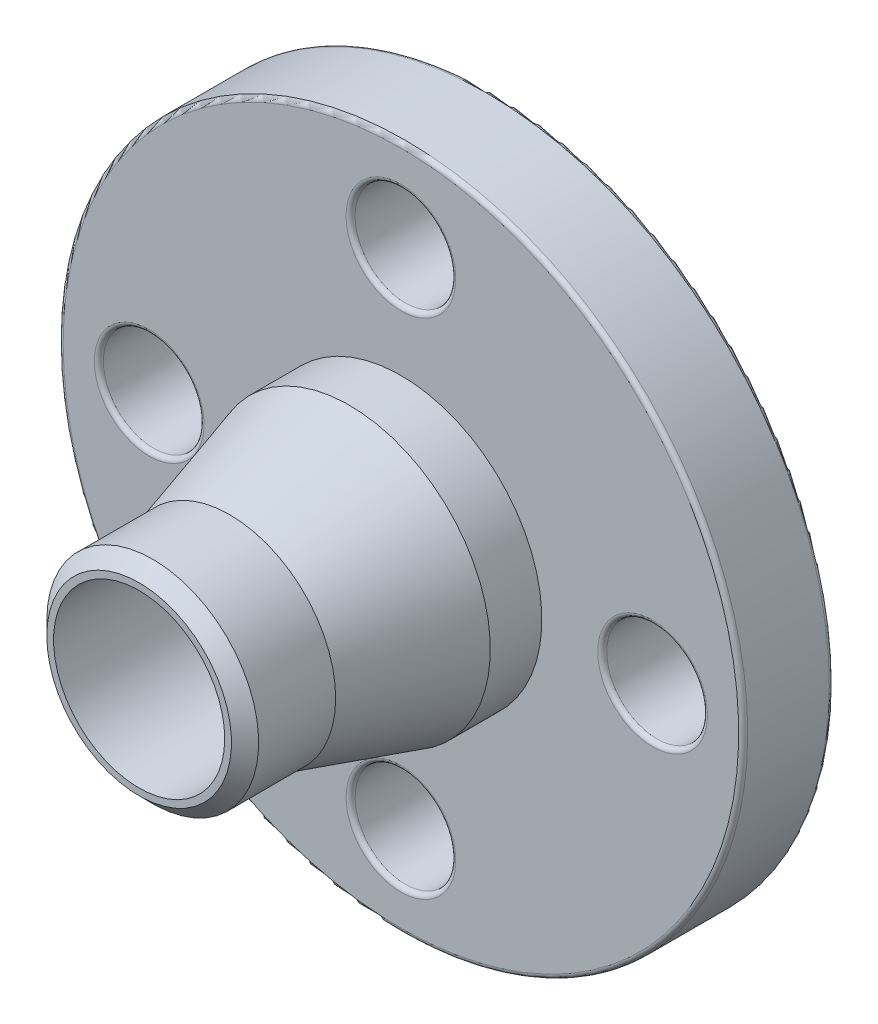
ISO-10303-21;
HEADER;
FILE_DESCRIPTION(('STEP AP214'),'2;1');
FILE_NAME('part.step','',(''),(''),'','','');
FILE_SCHEMA(('AUTOMOTIVE_DESIGN { 1 0 10303 214 1 1 1 1 }'));
ENDSEC;
DATA;
#1=APPLICATION_CONTEXT('core data for automotive mechanical design processes');
#2=APPLICATION_PROTOCOL_DEFINITION('international standard','automotive_design',2000,#1);
#3=PRODUCT_CONTEXT('',#1,'mechanical');
#4=PRODUCT('Part','Part','',(#3));
#5=PRODUCT_RELATED_PRODUCT_CATEGORY('part','',(#4));
#6=PRODUCT_DEFINITION_FORMATION('','',#4);
#7=PRODUCT_DEFINITION_CONTEXT('part definition',#1,'design');
#8=PRODUCT_DEFINITION('design','',#6,#7);
#9=PRODUCT_DEFINITION_SHAPE('','',#8);
#10=(LENGTH_UNIT() NAMED_UNIT(*) SI_UNIT(.MILLI.,.METRE.));
#11=(NAMED_UNIT(*) PLANE_ANGLE_UNIT() SI_UNIT($,.RADIAN.));
#12=(NAMED_UNIT(*) SI_UNIT($,.STERADIAN.) SOLID_ANGLE_UNIT());
#13=UNCERTAINTY_MEASURE_WITH_UNIT(LENGTH_MEASURE(1.E-05),#10,'distance_accuracy_value','');
#14=(GEOMETRIC_REPRESENTATION_CONTEXT(3) GLOBAL_UNCERTAINTY_ASSIGNED_CONTEXT((#13)) GLOBAL_UNIT_ASSIGNED_CONTEXT((#10,
#11,#12)) REPRESENTATION_CONTEXT('',''));
#15=CARTESIAN_POINT('',(0.,0.,0.));
#16=DIRECTION('',(0.,0.,1.));
#17=DIRECTION('',(1.,0.,0.));
#18=AXIS2_PLACEMENT_3D('',#15,#16,#17);
#19=CARTESIAN_POINT('',(0.,0.,-13.49375));
#20=DIRECTION('',(0.,0.,-1.));
#21=DIRECTION('',(-1.,0.,0.));
#22=AXIS2_PLACEMENT_3D('',#19,#20,#21);
#23=CONICAL_SURFACE('',#22,24.60625,0.2849682946417);
#24=CARTESIAN_POINT('',(0.,0.,13.49375));
#25=DIRECTION('',(0.,0.,1.));
#26=DIRECTION('',(1.,0.,0.));
#27=AXIS2_PLACEMENT_3D('',#24,#25,#26);
#28=CIRCLE('',#27,16.7005);
#29=CARTESIAN_POINT('',(16.7005,0.,13.49375));
#30=VERTEX_POINT('',#29);
#31=EDGE_CURVE('E65',#30,#30,#28,.T.);
#32=ORIENTED_EDGE('',*,*,#31,.F.);
#33=EDGE_LOOP('',(#32));
#34=FACE_BOUND('',#33,.T.);
#35=CARTESIAN_POINT('',(0.,0.,-5.36498493975903));
#36=DIRECTION('',(0.,0.,-1.));
#37=DIRECTION('',(-1.,0.,0.));
#38=AXIS2_PLACEMENT_3D('',#35,#36,#37);
#39=CIRCLE('',#38,22.225);
#40=CARTESIAN_POINT('',(-22.225,0.,-5.36498493975903));
#41=VERTEX_POINT('',#40);
#42=EDGE_CURVE('E62',#41,#41,#39,.T.);
#43=ORIENTED_EDGE('',*,*,#42,.F.);
#44=EDGE_LOOP('',(#43));
#45=FACE_BOUND('',#44,.T.);
#46=ADVANCED_FACE('F44',(#34,#45),#23,.T.);
#47=CARTESIAN_POINT('',(0.,0.,27.78125));
#48=DIRECTION('',(0.,0.,1.));
#49=DIRECTION('',(1.,0.,0.));
#50=AXIS2_PLACEMENT_3D('',#47,#48,#49);
#51=CYLINDRICAL_SURFACE('',#50,16.7005);
#52=CARTESIAN_POINT('',(0.,0.,25.638125));
#53=DIRECTION('',(0.,0.,-1.));
#54=DIRECTION('',(-1.,0.,0.));
#55=AXIS2_PLACEMENT_3D('',#52,#53,#54);
#56=CIRCLE('',#55,16.7005);
#57=CARTESIAN_POINT('',(-16.7005,0.,25.638125));
#58=VERTEX_POINT('',#57);
#59=EDGE_CURVE('E91',#58,#58,#56,.T.);
#60=ORIENTED_EDGE('',*,*,#59,.T.);
#61=EDGE_LOOP('',(#60));
#62=FACE_BOUND('',#61,.T.);
#63=ORIENTED_EDGE('',*,*,#31,.T.);
#64=EDGE_LOOP('',(#63));
#65=FACE_BOUND('',#64,.T.);
#66=ADVANCED_FACE('F193',(#62,#65),#51,.T.);
#67=CARTESIAN_POINT('',(0.,16.7005,27.78125));
#68=DIRECTION('',(0.,0.,-1.));
#69=DIRECTION('',(-1.,0.,0.));
#70=AXIS2_PLACEMENT_3D('',#67,#68,#69);
#71=PLANE('',#70);
#72=CARTESIAN_POINT('',(0.,0.,27.78125));
#73=DIRECTION('',(0.,0.,-1.));
#74=DIRECTION('',(-1.,0.,0.));
#75=AXIS2_PLACEMENT_3D('',#72,#73,#74);
#76=CIRCLE('',#75,14.557375);
#77=CARTESIAN_POINT('',(-14.557375,0.,27.78125));
#78=VERTEX_POINT('',#77);
#79=EDGE_CURVE('E87',#78,#78,#76,.F.);
#80=ORIENTED_EDGE('',*,*,#79,.T.);
#81=EDGE_LOOP('',(#80));
#82=FACE_BOUND('',#81,.T.);
#83=CARTESIAN_POINT('',(0.,0.,27.78125));
#84=DIRECTION('',(0.,0.,1.));
#85=DIRECTION('',(1.,0.,0.));
#86=AXIS2_PLACEMENT_3D('',#83,#84,#85);
#87=CIRCLE('',#86,13.49375);
#88=CARTESIAN_POINT('',(13.49375,0.,27.78125));
#89=VERTEX_POINT('',#88);
#90=EDGE_CURVE('E72',#89,#89,#87,.T.);
#91=ORIENTED_EDGE('',*,*,#90,.F.);
#92=EDGE_LOOP('',(#91));
#93=FACE_BOUND('',#92,.T.);
#94=ADVANCED_FACE('F201',(#82,#93),#71,.F.);
#95=CARTESIAN_POINT('',(0.,0.,27.78125));
#96=DIRECTION('',(0.,0.,1.));
#97=DIRECTION('',(1.,0.,0.));
#98=AXIS2_PLACEMENT_3D('',#95,#96,#97);
#99=CYLINDRICAL_SURFACE('',#98,13.49375);
#100=CARTESIAN_POINT('',(0.,0.,-21.43125));
#101=DIRECTION('',(0.,0.,1.));
#102=DIRECTION('',(1.,0.,0.));
#103=AXIS2_PLACEMENT_3D('',#100,#101,#102);
#104=CIRCLE('',#103,13.49375);
#105=CARTESIAN_POINT('',(13.49375,0.,-21.43125));
#106=VERTEX_POINT('',#105);
#107=EDGE_CURVE('E48',#106,#106,#104,.F.);
#108=ORIENTED_EDGE('',*,*,#107,.T.);
#109=EDGE_LOOP('',(#108));
#110=FACE_BOUND('',#109,.T.);
#111=ORIENTED_EDGE('',*,*,#90,.T.);
#112=EDGE_LOOP('',(#111));
#113=FACE_BOUND('',#112,.T.);
#114=ADVANCED_FACE('F215',(#110,#113),#99,.F.);
#115=CARTESIAN_POINT('',(0.,13.49375,-27.78125));
#116=DIRECTION('',(0.,0.,1.));
#117=DIRECTION('',(1.,0.,0.));
#118=AXIS2_PLACEMENT_3D('',#115,#116,#117);
#119=PLANE('',#118);
#120=CARTESIAN_POINT('',(0.,0.,-27.78125));
#121=DIRECTION('',(0.,0.,-1.));
#122=DIRECTION('',(-1.,0.,0.));
#123=AXIS2_PLACEMENT_3D('',#120,#121,#122);
#124=CIRCLE('',#123,22.225);
#125=CARTESIAN_POINT('',(-22.225,0.,-27.78125));
#126=VERTEX_POINT('',#125);
#127=EDGE_CURVE('E289',#126,#126,#124,.T.);
#128=ORIENTED_EDGE('',*,*,#127,.F.);
#129=EDGE_LOOP('',(#128));
#130=FACE_BOUND('',#129,.T.);
#131=CARTESIAN_POINT('',(0.,0.,-27.78125));
#132=DIRECTION('',(0.,0.,1.));
#133=DIRECTION('',(1.,0.,0.));
#134=AXIS2_PLACEMENT_3D('',#131,#132,#133);
#135=CIRCLE('',#134,53.260625);
#136=CARTESIAN_POINT('',(53.260625,0.,-27.78125));
#137=VERTEX_POINT('',#136);
#138=EDGE_CURVE('E111',#137,#137,#135,.F.);
#139=ORIENTED_EDGE('',*,*,#138,.T.);
#140=EDGE_LOOP('',(#139));
#141=FACE_BOUND('',#140,.T.);
#142=CARTESIAN_POINT('',(0.,39.6875,-27.78125));
#143=DIRECTION('',(0.,0.,1.));
#144=DIRECTION('',(1.,0.,0.));
#145=AXIS2_PLACEMENT_3D('',#142,#143,#144);
#146=CIRCLE('',#145,8.651875);
#147=CARTESIAN_POINT('',(8.651875,39.6875,-27.78125));
#148=VERTEX_POINT('',#147);
#149=EDGE_CURVE('E107',#148,#148,#146,.T.);
#150=ORIENTED_EDGE('',*,*,#149,.T.);
#151=EDGE_LOOP('',(#150));
#152=FACE_BOUND('',#151,.T.);
#153=CARTESIAN_POINT('',(-39.6875,4.15704496906011E-13,-27.78125));
#154=DIRECTION('',(0.,0.,1.));
#155=DIRECTION('',(1.,0.,0.));
#156=AXIS2_PLACEMENT_3D('',#153,#154,#155);
#157=CIRCLE('',#156,8.651875);
#158=CARTESIAN_POINT('',(-31.035625,4.15704496906011E-13,-27.78125));
#159=VERTEX_POINT('',#158);
#160=EDGE_CURVE('E103',#159,#159,#157,.T.);
#161=ORIENTED_EDGE('',*,*,#160,.T.);
#162=EDGE_LOOP('',(#161));
#163=FACE_BOUND('',#162,.T.);
#164=CARTESIAN_POINT('',(0.,-39.6875,-27.78125));
#165=DIRECTION('',(0.,0.,1.));
#166=DIRECTION('',(1.,0.,0.));
#167=AXIS2_PLACEMENT_3D('',#164,#165,#166);
#168=CIRCLE('',#167,8.651875);
#169=CARTESIAN_POINT('',(8.651875,-39.6875,-27.78125));
#170=VERTEX_POINT('',#169);
#171=EDGE_CURVE('E99',#170,#170,#168,.T.);
#172=ORIENTED_EDGE('',*,*,#171,.T.);
#173=EDGE_LOOP('',(#172));
#174=FACE_BOUND('',#173,.T.);
#175=CARTESIAN_POINT('',(39.6875,-1.38568165635337E-13,-27.78125));
#176=DIRECTION('',(0.,0.,1.));
#177=DIRECTION('',(1.,0.,0.));
#178=AXIS2_PLACEMENT_3D('',#175,#176,#177);
#179=CIRCLE('',#178,8.651875);
#180=CARTESIAN_POINT('',(48.339375,-1.38568165635337E-13,-27.78125));
#181=VERTEX_POINT('',#180);
#182=EDGE_CURVE('E95',#181,#181,#179,.T.);
#183=ORIENTED_EDGE('',*,*,#182,.T.);
#184=EDGE_LOOP('',(#183));
#185=FACE_BOUND('',#184,.T.);
#186=ADVANCED_FACE('F211',(#130,#141,#152,#163,#174,#185),#119,.F.);
#187=CARTESIAN_POINT('',(0.,0.,27.78125));
#188=DIRECTION('',(0.,0.,1.));
#189=DIRECTION('',(1.,0.,0.));
#190=AXIS2_PLACEMENT_3D('',#187,#188,#189);
#191=CYLINDRICAL_SURFACE('',#190,53.975);
#192=CARTESIAN_POINT('',(0.,0.,-27.066875));
#193=DIRECTION('',(0.,0.,1.));
#194=DIRECTION('',(1.,0.,0.));
#195=AXIS2_PLACEMENT_3D('',#192,#193,#194);
#196=CIRCLE('',#195,53.975);
#197=CARTESIAN_POINT('',(53.975,0.,-27.066875));
#198=VERTEX_POINT('',#197);
#199=EDGE_CURVE('E119',#198,#198,#196,.T.);
#200=ORIENTED_EDGE('',*,*,#199,.T.);
#201=EDGE_LOOP('',(#200));
#202=FACE_BOUND('',#201,.T.);
#203=CARTESIAN_POINT('',(0.,0.,-14.208125));
#204=DIRECTION('',(0.,0.,-1.));
#205=DIRECTION('',(-1.,0.,0.));
#206=AXIS2_PLACEMENT_3D('',#203,#204,#205);
#207=CIRCLE('',#206,53.975);
#208=CARTESIAN_POINT('',(-53.975,0.,-14.208125));
#209=VERTEX_POINT('',#208);
#210=EDGE_CURVE('E115',#209,#209,#207,.T.);
#211=ORIENTED_EDGE('',*,*,#210,.T.);
#212=EDGE_LOOP('',(#211));
#213=FACE_BOUND('',#212,.T.);
#214=ADVANCED_FACE('F208',(#202,#213),#191,.T.);
#215=CARTESIAN_POINT('',(0.,53.975,-13.49375));
#216=DIRECTION('',(0.,0.,-1.));
#217=DIRECTION('',(-1.,0.,0.));
#218=AXIS2_PLACEMENT_3D('',#215,#216,#217);
#219=PLANE('',#218);
#220=CARTESIAN_POINT('',(0.,0.,-13.49375));
#221=DIRECTION('',(0.,0.,-1.));
#222=DIRECTION('',(-1.,0.,0.));
#223=AXIS2_PLACEMENT_3D('',#220,#221,#222);
#224=CIRCLE('',#223,53.260625);
#225=CARTESIAN_POINT('',(-53.260625,0.,-13.49375));
#226=VERTEX_POINT('',#225);
#227=EDGE_CURVE('E11',#226,#226,#224,.F.);
#228=ORIENTED_EDGE('',*,*,#227,.T.);
#229=EDGE_LOOP('',(#228));
#230=FACE_BOUND('',#229,.T.);
#231=CARTESIAN_POINT('',(0.,39.6875,-13.49375));
#232=DIRECTION('',(0.,0.,-1.));
#233=DIRECTION('',(-1.,0.,0.));
#234=AXIS2_PLACEMENT_3D('',#231,#232,#233);
#235=CIRCLE('',#234,8.651875);
#236=CARTESIAN_POINT('',(-8.651875,39.6875,-13.49375));
#237=VERTEX_POINT('',#236);
#238=EDGE_CURVE('E53',#237,#237,#235,.T.);
#239=ORIENTED_EDGE('',*,*,#238,.T.);
#240=EDGE_LOOP('',(#239));
#241=FACE_BOUND('',#240,.T.);
#242=CARTESIAN_POINT('',(-39.6875,4.15704496906011E-13,-13.49375));
#243=DIRECTION('',(0.,0.,-1.));
#244=DIRECTION('',(-1.,0.,0.));
#245=AXIS2_PLACEMENT_3D('',#242,#243,#244);
#246=CIRCLE('',#245,8.651875);
#247=CARTESIAN_POINT('',(-48.339375,4.15704496906011E-13,-13.49375));
#248=VERTEX_POINT('',#247);
#249=EDGE_CURVE('E59',#248,#248,#246,.T.);
#250=ORIENTED_EDGE('',*,*,#249,.T.);
#251=EDGE_LOOP('',(#250));
#252=FACE_BOUND('',#251,.T.);
#253=CARTESIAN_POINT('',(0.,-39.6875,-13.49375));
#254=DIRECTION('',(0.,0.,-1.));
#255=DIRECTION('',(-1.,0.,0.));
#256=AXIS2_PLACEMENT_3D('',#253,#254,#255);
#257=CIRCLE('',#256,8.651875);
#258=CARTESIAN_POINT('',(-8.651875,-39.6875,-13.49375));
#259=VERTEX_POINT('',#258);
#260=EDGE_CURVE('E159',#259,#259,#257,.T.);
#261=ORIENTED_EDGE('',*,*,#260,.T.);
#262=EDGE_LOOP('',(#261));
#263=FACE_BOUND('',#262,.T.);
#264=CARTESIAN_POINT('',(39.6875,-1.38568165635337E-13,-13.49375));
#265=DIRECTION('',(0.,0.,-1.));
#266=DIRECTION('',(-1.,0.,0.));
#267=AXIS2_PLACEMENT_3D('',#264,#265,#266);
#268=CIRCLE('',#267,8.651875);
#269=CARTESIAN_POINT('',(31.035625,-1.38568165635337E-13,-13.49375));
#270=VERTEX_POINT('',#269);
#271=EDGE_CURVE('E155',#270,#270,#268,.T.);
#272=ORIENTED_EDGE('',*,*,#271,.T.);
#273=EDGE_LOOP('',(#272));
#274=FACE_BOUND('',#273,.T.);
#275=CARTESIAN_POINT('',(0.,0.,-13.49375));
#276=DIRECTION('',(0.,0.,-1.));
#277=DIRECTION('',(-1.,0.,0.));
#278=AXIS2_PLACEMENT_3D('',#275,#276,#277);
#279=CIRCLE('',#278,22.225);
#280=CARTESIAN_POINT('',(-22.225,0.,-13.49375));
#281=VERTEX_POINT('',#280);
#282=EDGE_CURVE('E66',#281,#281,#279,.F.);
#283=ORIENTED_EDGE('',*,*,#282,.F.);
#284=EDGE_LOOP('',(#283));
#285=FACE_BOUND('',#284,.T.);
#286=ADVANCED_FACE('F166',(#230,#241,#252,#263,#274,#285),#219,.F.);
#287=CARTESIAN_POINT('',(0.,39.6875,-27.78125));
#288=DIRECTION('',(0.,0.,1.));
#289=DIRECTION('',(1.,0.,0.));
#290=AXIS2_PLACEMENT_3D('',#287,#288,#289);
#291=CYLINDRICAL_SURFACE('',#290,7.9375);
#292=CARTESIAN_POINT('',(0.,39.6875,-27.066875));
#293=DIRECTION('',(0.,0.,1.));
#294=DIRECTION('',(1.,0.,0.));
#295=AXIS2_PLACEMENT_3D('',#292,#293,#294);
#296=CIRCLE('',#295,7.9375);
#297=CARTESIAN_POINT('',(7.9375,39.6875,-27.066875));
#298=VERTEX_POINT('',#297);
#299=EDGE_CURVE('E127',#298,#298,#296,.F.);
#300=ORIENTED_EDGE('',*,*,#299,.T.);
#301=EDGE_LOOP('',(#300));
#302=FACE_BOUND('',#301,.T.);
#303=CARTESIAN_POINT('',(0.,39.6875,-14.208125));
#304=DIRECTION('',(0.,0.,-1.));
#305=DIRECTION('',(-1.,0.,0.));
#306=AXIS2_PLACEMENT_3D('',#303,#304,#305);
#307=CIRCLE('',#306,7.9375);
#308=CARTESIAN_POINT('',(-7.9375,39.6875,-14.208125));
#309=VERTEX_POINT('',#308);
#310=EDGE_CURVE('E123',#309,#309,#307,.F.);
#311=ORIENTED_EDGE('',*,*,#310,.T.);
#312=EDGE_LOOP('',(#311));
#313=FACE_BOUND('',#312,.T.);
#314=ADVANCED_FACE('F180',(#302,#313),#291,.F.);
#315=CARTESIAN_POINT('',(-39.6875,4.15704496906011E-13,-27.78125));
#316=DIRECTION('',(0.,0.,1.));
#317=DIRECTION('',(1.,0.,0.));
#318=AXIS2_PLACEMENT_3D('',#315,#316,#317);
#319=CYLINDRICAL_SURFACE('',#318,7.9375);
#320=CARTESIAN_POINT('',(-39.6875,4.15704496906011E-13,-27.066875));
#321=DIRECTION('',(0.,0.,1.));
#322=DIRECTION('',(1.,0.,0.));
#323=AXIS2_PLACEMENT_3D('',#320,#321,#322);
#324=CIRCLE('',#323,7.9375);
#325=CARTESIAN_POINT('',(-31.75,4.15704496906011E-13,-27.066875));
#326=VERTEX_POINT('',#325);
#327=EDGE_CURVE('E135',#326,#326,#324,.F.);
#328=ORIENTED_EDGE('',*,*,#327,.T.);
#329=EDGE_LOOP('',(#328));
#330=FACE_BOUND('',#329,.T.);
#331=CARTESIAN_POINT('',(-39.6875,4.15704496906011E-13,-14.208125));
#332=DIRECTION('',(0.,0.,-1.));
#333=DIRECTION('',(-1.,0.,0.));
#334=AXIS2_PLACEMENT_3D('',#331,#332,#333);
#335=CIRCLE('',#334,7.9375);
#336=CARTESIAN_POINT('',(-47.625,4.15704496906011E-13,-14.208125));
#337=VERTEX_POINT('',#336);
#338=EDGE_CURVE('E131',#337,#337,#335,.F.);
#339=ORIENTED_EDGE('',*,*,#338,.T.);
#340=EDGE_LOOP('',(#339));
#341=FACE_BOUND('',#340,.T.);
#342=ADVANCED_FACE('F177',(#330,#341),#319,.F.);
#343=CARTESIAN_POINT('',(0.,-39.6875,-27.78125));
#344=DIRECTION('',(0.,0.,1.));
#345=DIRECTION('',(1.,0.,0.));
#346=AXIS2_PLACEMENT_3D('',#343,#344,#345);
#347=CYLINDRICAL_SURFACE('',#346,7.9375);
#348=CARTESIAN_POINT('',(0.,-39.6875,-27.066875));
#349=DIRECTION('',(0.,0.,1.));
#350=DIRECTION('',(1.,0.,0.));
#351=AXIS2_PLACEMENT_3D('',#348,#349,#350);
#352=CIRCLE('',#351,7.9375);
#353=CARTESIAN_POINT('',(7.9375,-39.6875,-27.066875));
#354=VERTEX_POINT('',#353);
#355=EDGE_CURVE('E143',#354,#354,#352,.F.);
#356=ORIENTED_EDGE('',*,*,#355,.T.);
#357=EDGE_LOOP('',(#356));
#358=FACE_BOUND('',#357,.T.);
#359=CARTESIAN_POINT('',(0.,-39.6875,-14.208125));
#360=DIRECTION('',(0.,0.,-1.));
#361=DIRECTION('',(-1.,0.,0.));
#362=AXIS2_PLACEMENT_3D('',#359,#360,#361);
#363=CIRCLE('',#362,7.9375);
#364=CARTESIAN_POINT('',(-7.9375,-39.6875,-14.208125));
#365=VERTEX_POINT('',#364);
#366=EDGE_CURVE('E139',#365,#365,#363,.F.);
#367=ORIENTED_EDGE('',*,*,#366,.T.);
#368=EDGE_LOOP('',(#367));
#369=FACE_BOUND('',#368,.T.);
#370=ADVANCED_FACE('F179',(#358,#369),#347,.F.);
#371=CARTESIAN_POINT('',(39.6875,-1.38568165635337E-13,-27.78125));
#372=DIRECTION('',(0.,0.,1.));
#373=DIRECTION('',(1.,0.,0.));
#374=AXIS2_PLACEMENT_3D('',#371,#372,#373);
#375=CYLINDRICAL_SURFACE('',#374,7.9375);
#376=CARTESIAN_POINT('',(39.6875,-1.38568165635337E-13,-27.066875));
#377=DIRECTION('',(0.,0.,1.));
#378=DIRECTION('',(1.,0.,0.));
#379=AXIS2_PLACEMENT_3D('',#376,#377,#378);
#380=CIRCLE('',#379,7.9375);
#381=CARTESIAN_POINT('',(47.625,-1.38568165635337E-13,-27.066875));
#382=VERTEX_POINT('',#381);
#383=EDGE_CURVE('E151',#382,#382,#380,.F.);
#384=ORIENTED_EDGE('',*,*,#383,.T.);
#385=EDGE_LOOP('',(#384));
#386=FACE_BOUND('',#385,.T.);
#387=CARTESIAN_POINT('',(39.6875,-1.38568165635337E-13,-14.208125));
#388=DIRECTION('',(0.,0.,-1.));
#389=DIRECTION('',(-1.,0.,0.));
#390=AXIS2_PLACEMENT_3D('',#387,#388,#389);
#391=CIRCLE('',#390,7.9375);
#392=CARTESIAN_POINT('',(31.75,-1.38568165635337E-13,-14.208125));
#393=VERTEX_POINT('',#392);
#394=EDGE_CURVE('E147',#393,#393,#391,.F.);
#395=ORIENTED_EDGE('',*,*,#394,.T.);
#396=EDGE_LOOP('',(#395));
#397=FACE_BOUND('',#396,.T.);
#398=ADVANCED_FACE('F187',(#386,#397),#375,.F.);
#399=CARTESIAN_POINT('',(0.,0.,27.78125));
#400=DIRECTION('',(0.,0.,-1.));
#401=DIRECTION('',(-1.,0.,0.));
#402=AXIS2_PLACEMENT_3D('',#399,#400,#401);
#403=CONICAL_SURFACE('',#402,14.557375,0.785398163397449);
#404=ORIENTED_EDGE('',*,*,#59,.F.);
#405=EDGE_LOOP('',(#404));
#406=FACE_BOUND('',#405,.T.);
#407=ORIENTED_EDGE('',*,*,#79,.F.);
#408=EDGE_LOOP('',(#407));
#409=FACE_BOUND('',#408,.T.);
#410=ADVANCED_FACE('F223',(#406,#409),#403,.T.);
#411=CARTESIAN_POINT('',(0.,0.,-27.066875));
#412=DIRECTION('',(0.,0.,1.));
#413=DIRECTION('',(1.,0.,0.));
#414=AXIS2_PLACEMENT_3D('',#411,#412,#413);
#415=TOROIDAL_SURFACE('',#414,53.260625,0.714375);
#416=ORIENTED_EDGE('',*,*,#138,.F.);
#417=EDGE_LOOP('',(#416));
#418=FACE_BOUND('',#417,.T.);
#419=ORIENTED_EDGE('',*,*,#199,.F.);
#420=EDGE_LOOP('',(#419));
#421=FACE_BOUND('',#420,.T.);
#422=ADVANCED_FACE('F226',(#418,#421),#415,.T.);
#423=CARTESIAN_POINT('',(0.,39.6875,-27.066875));
#424=DIRECTION('',(0.,0.,1.));
#425=DIRECTION('',(1.,0.,0.));
#426=AXIS2_PLACEMENT_3D('',#423,#424,#425);
#427=TOROIDAL_SURFACE('',#426,8.651875,0.714375);
#428=ORIENTED_EDGE('',*,*,#299,.F.);
#429=EDGE_LOOP('',(#428));
#430=FACE_BOUND('',#429,.T.);
#431=ORIENTED_EDGE('',*,*,#149,.F.);
#432=EDGE_LOOP('',(#431));
#433=FACE_BOUND('',#432,.T.);
#434=ADVANCED_FACE('F230',(#430,#433),#427,.T.);
#435=CARTESIAN_POINT('',(-39.6875,4.15704496906011E-13,-27.066875));
#436=DIRECTION('',(0.,0.,1.));
#437=DIRECTION('',(1.,0.,0.));
#438=AXIS2_PLACEMENT_3D('',#435,#436,#437);
#439=TOROIDAL_SURFACE('',#438,8.651875,0.714375);
#440=ORIENTED_EDGE('',*,*,#327,.F.);
#441=EDGE_LOOP('',(#440));
#442=FACE_BOUND('',#441,.T.);
#443=ORIENTED_EDGE('',*,*,#160,.F.);
#444=EDGE_LOOP('',(#443));
#445=FACE_BOUND('',#444,.T.);
#446=ADVANCED_FACE('F234',(#442,#445),#439,.T.);
#447=CARTESIAN_POINT('',(0.,-39.6875,-27.066875));
#448=DIRECTION('',(0.,0.,1.));
#449=DIRECTION('',(1.,0.,0.));
#450=AXIS2_PLACEMENT_3D('',#447,#448,#449);
#451=TOROIDAL_SURFACE('',#450,8.651875,0.714375);
#452=ORIENTED_EDGE('',*,*,#355,.F.);
#453=EDGE_LOOP('',(#452));
#454=FACE_BOUND('',#453,.T.);
#455=ORIENTED_EDGE('',*,*,#171,.F.);
#456=EDGE_LOOP('',(#455));
#457=FACE_BOUND('',#456,.T.);
#458=ADVANCED_FACE('F238',(#454,#457),#451,.T.);
#459=CARTESIAN_POINT('',(39.6875,-1.38568165635337E-13,-27.066875));
#460=DIRECTION('',(0.,0.,1.));
#461=DIRECTION('',(1.,0.,0.));
#462=AXIS2_PLACEMENT_3D('',#459,#460,#461);
#463=TOROIDAL_SURFACE('',#462,8.651875,0.714375);
#464=ORIENTED_EDGE('',*,*,#383,.F.);
#465=EDGE_LOOP('',(#464));
#466=FACE_BOUND('',#465,.T.);
#467=ORIENTED_EDGE('',*,*,#182,.F.);
#468=EDGE_LOOP('',(#467));
#469=FACE_BOUND('',#468,.T.);
#470=ADVANCED_FACE('F242',(#466,#469),#463,.T.);
#471=CARTESIAN_POINT('',(0.,0.,-14.208125));
#472=DIRECTION('',(0.,0.,-1.));
#473=DIRECTION('',(-1.,0.,0.));
#474=AXIS2_PLACEMENT_3D('',#471,#472,#473);
#475=TOROIDAL_SURFACE('',#474,53.260625,0.714375);
#476=ORIENTED_EDGE('',*,*,#210,.F.);
#477=EDGE_LOOP('',(#476));
#478=FACE_BOUND('',#477,.T.);
#479=ORIENTED_EDGE('',*,*,#227,.F.);
#480=EDGE_LOOP('',(#479));
#481=FACE_BOUND('',#480,.T.);
#482=ADVANCED_FACE('F246',(#478,#481),#475,.T.);
#483=CARTESIAN_POINT('',(0.,39.6875,-14.208125));
#484=DIRECTION('',(0.,0.,-1.));
#485=DIRECTION('',(-1.,0.,0.));
#486=AXIS2_PLACEMENT_3D('',#483,#484,#485);
#487=TOROIDAL_SURFACE('',#486,8.651875,0.714375);
#488=ORIENTED_EDGE('',*,*,#238,.F.);
#489=EDGE_LOOP('',(#488));
#490=FACE_BOUND('',#489,.T.);
#491=ORIENTED_EDGE('',*,*,#310,.F.);
#492=EDGE_LOOP('',(#491));
#493=FACE_BOUND('',#492,.T.);
#494=ADVANCED_FACE('F173',(#490,#493),#487,.T.);
#495=CARTESIAN_POINT('',(-39.6875,4.15704496906011E-13,-14.208125));
#496=DIRECTION('',(0.,0.,-1.));
#497=DIRECTION('',(-1.,0.,0.));
#498=AXIS2_PLACEMENT_3D('',#495,#496,#497);
#499=TOROIDAL_SURFACE('',#498,8.651875,0.714375);
#500=ORIENTED_EDGE('',*,*,#249,.F.);
#501=EDGE_LOOP('',(#500));
#502=FACE_BOUND('',#501,.T.);
#503=ORIENTED_EDGE('',*,*,#338,.F.);
#504=EDGE_LOOP('',(#503));
#505=FACE_BOUND('',#504,.T.);
#506=ADVANCED_FACE('F169',(#502,#505),#499,.T.);
#507=CARTESIAN_POINT('',(0.,-39.6875,-14.208125));
#508=DIRECTION('',(0.,0.,-1.));
#509=DIRECTION('',(-1.,0.,0.));
#510=AXIS2_PLACEMENT_3D('',#507,#508,#509);
#511=TOROIDAL_SURFACE('',#510,8.651875,0.714375);
#512=ORIENTED_EDGE('',*,*,#260,.F.);
#513=EDGE_LOOP('',(#512));
#514=FACE_BOUND('',#513,.T.);
#515=ORIENTED_EDGE('',*,*,#366,.F.);
#516=EDGE_LOOP('',(#515));
#517=FACE_BOUND('',#516,.T.);
#518=ADVANCED_FACE('F172',(#514,#517),#511,.T.);
#519=CARTESIAN_POINT('',(39.6875,-1.38568165635337E-13,-14.208125));
#520=DIRECTION('',(0.,0.,-1.));
#521=DIRECTION('',(-1.,0.,0.));
#522=AXIS2_PLACEMENT_3D('',#519,#520,#521);
#523=TOROIDAL_SURFACE('',#522,8.651875,0.714375);
#524=ORIENTED_EDGE('',*,*,#271,.F.);
#525=EDGE_LOOP('',(#524));
#526=FACE_BOUND('',#525,.T.);
#527=ORIENTED_EDGE('',*,*,#394,.F.);
#528=EDGE_LOOP('',(#527));
#529=FACE_BOUND('',#528,.T.);
#530=ADVANCED_FACE('F46',(#526,#529),#523,.T.);
#531=CARTESIAN_POINT('',(0.,0.,-208.351436012103));
#532=DIRECTION('',(0.,0.,1.));
#533=DIRECTION('',(1.,0.,0.));
#534=AXIS2_PLACEMENT_3D('',#531,#532,#533);
#535=CYLINDRICAL_SURFACE('',#534,22.225);
#536=ORIENTED_EDGE('',*,*,#282,.T.);
#537=EDGE_LOOP('',(#536));
#538=FACE_BOUND('',#537,.T.);
#539=ORIENTED_EDGE('',*,*,#42,.T.);
#540=EDGE_LOOP('',(#539));
#541=FACE_BOUND('',#540,.T.);
#542=ADVANCED_FACE('F257',(#538,#541),#535,.T.);
#543=CARTESIAN_POINT('',(0.,13.49375,-21.43125));
#544=DIRECTION('',(0.,0.,1.));
#545=DIRECTION('',(1.,0.,0.));
#546=AXIS2_PLACEMENT_3D('',#543,#544,#545);
#547=PLANE('',#546);
#548=CARTESIAN_POINT('',(0.,0.,-21.43125));
#549=DIRECTION('',(0.,0.,1.));
#550=DIRECTION('',(1.,0.,0.));
#551=AXIS2_PLACEMENT_3D('',#548,#549,#550);
#552=CIRCLE('',#551,22.225);
#553=CARTESIAN_POINT('',(22.225,0.,-21.43125));
#554=VERTEX_POINT('',#553);
#555=EDGE_CURVE('E80',#554,#554,#552,.F.);
#556=ORIENTED_EDGE('',*,*,#555,.T.);
#557=EDGE_LOOP('',(#556));
#558=FACE_BOUND('',#557,.T.);
#559=ORIENTED_EDGE('',*,*,#107,.F.);
#560=EDGE_LOOP('',(#559));
#561=FACE_BOUND('',#560,.T.);
#562=ADVANCED_FACE('F277',(#558,#561),#547,.F.);
#563=CARTESIAN_POINT('',(0.,0.,47.7805428474841));
#564=DIRECTION('',(0.,0.,-1.));
#565=DIRECTION('',(-1.,0.,0.));
#566=AXIS2_PLACEMENT_3D('',#563,#564,#565);
#567=CYLINDRICAL_SURFACE('',#566,22.225);
#568=ORIENTED_EDGE('',*,*,#127,.T.);
#569=EDGE_LOOP('',(#568));
#570=FACE_BOUND('',#569,.T.);
#571=ORIENTED_EDGE('',*,*,#555,.F.);
#572=EDGE_LOOP('',(#571));
#573=FACE_BOUND('',#572,.T.);
#574=ADVANCED_FACE('F280',(#570,#573),#567,.F.);
#575=CLOSED_SHELL('',(#46,#66,#94,#114,#186,#214,#286,#314,#342,#370,#398,#410,#422,#434,#446,
#458,#470,#482,#494,#506,#518,#530,#542,#562,#574));
#576=MANIFOLD_SOLID_BREP('B2',#575);
#577=ADVANCED_BREP_SHAPE_REPRESENTATION('',(#18,#576),#14);
#578=SHAPE_DEFINITION_REPRESENTATION(#9,#577);
ENDSEC;
END-ISO-10303-21;
